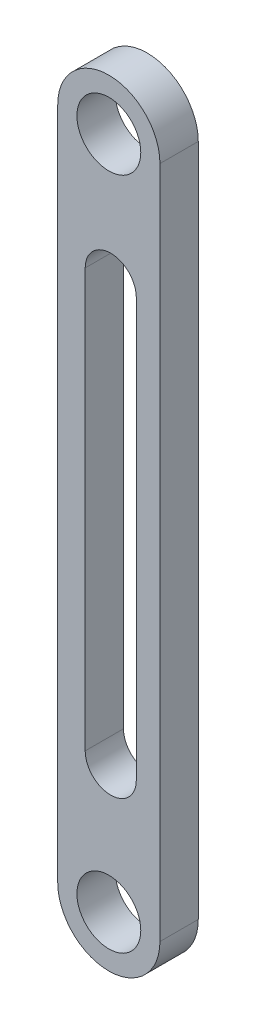
ISO-10303-21;
HEADER;
FILE_DESCRIPTION(('STEP AP214'),'2;1');
FILE_NAME('part.step','',(''),(''),'','','');
FILE_SCHEMA(('AUTOMOTIVE_DESIGN { 1 0 10303 214 1 1 1 1 }'));
ENDSEC;
DATA;
#1=APPLICATION_CONTEXT('core data for automotive mechanical design processes');
#2=APPLICATION_PROTOCOL_DEFINITION('international standard','automotive_design',2000,#1);
#3=PRODUCT_CONTEXT('',#1,'mechanical');
#4=PRODUCT('Part','Part','',(#3));
#5=PRODUCT_RELATED_PRODUCT_CATEGORY('part','',(#4));
#6=PRODUCT_DEFINITION_FORMATION('','',#4);
#7=PRODUCT_DEFINITION_CONTEXT('part definition',#1,'design');
#8=PRODUCT_DEFINITION('design','',#6,#7);
#9=PRODUCT_DEFINITION_SHAPE('','',#8);
#10=(LENGTH_UNIT() NAMED_UNIT(*) SI_UNIT(.MILLI.,.METRE.));
#11=(NAMED_UNIT(*) PLANE_ANGLE_UNIT() SI_UNIT($,.RADIAN.));
#12=(NAMED_UNIT(*) SI_UNIT($,.STERADIAN.) SOLID_ANGLE_UNIT());
#13=UNCERTAINTY_MEASURE_WITH_UNIT(LENGTH_MEASURE(1.E-05),#10,'distance_accuracy_value','');
#14=(GEOMETRIC_REPRESENTATION_CONTEXT(3) GLOBAL_UNCERTAINTY_ASSIGNED_CONTEXT((#13)) GLOBAL_UNIT_ASSIGNED_CONTEXT((#10,
#11,#12)) REPRESENTATION_CONTEXT('',''));
#15=CARTESIAN_POINT('',(0.,0.,0.));
#16=DIRECTION('',(0.,0.,1.));
#17=DIRECTION('',(1.,0.,0.));
#18=AXIS2_PLACEMENT_3D('',#15,#16,#17);
#19=CARTESIAN_POINT('',(-0.794117647058825,-16.5294117647059,3.));
#20=DIRECTION('',(0.,0.,-1.));
#21=DIRECTION('',(-1.,0.,0.));
#22=AXIS2_PLACEMENT_3D('',#19,#20,#21);
#23=CYLINDRICAL_SURFACE('',#22,4.);
#24=CARTESIAN_POINT('',(-0.794117647058825,-16.5294117647059,0.));
#25=DIRECTION('',(0.,0.,1.));
#26=DIRECTION('',(-1.,0.,0.));
#27=AXIS2_PLACEMENT_3D('',#24,#25,#26);
#28=CIRCLE('',#27,4.);
#29=CARTESIAN_POINT('',(-4.79411764705882,-16.5294117647059,0.));
#30=VERTEX_POINT('',#29);
#31=CARTESIAN_POINT('',(3.20588235294117,-16.5294117647059,0.));
#32=VERTEX_POINT('',#31);
#33=EDGE_CURVE('E159',#30,#32,#28,.T.);
#34=ORIENTED_EDGE('',*,*,#33,.T.);
#35=DIRECTION('',(0.,0.,-1.));
#36=VECTOR('',#35,1.);
#37=CARTESIAN_POINT('',(3.20588235294117,-16.5294117647059,3.));
#38=LINE('',#37,#36);
#39=CARTESIAN_POINT('',(3.20588235294117,-16.5294117647059,3.));
#40=VERTEX_POINT('',#39);
#41=EDGE_CURVE('E11',#40,#32,#38,.T.);
#42=ORIENTED_EDGE('',*,*,#41,.F.);
#43=CARTESIAN_POINT('',(-0.794117647058825,-16.5294117647059,3.));
#44=DIRECTION('',(0.,0.,1.));
#45=DIRECTION('',(-1.,0.,0.));
#46=AXIS2_PLACEMENT_3D('',#43,#44,#45);
#47=CIRCLE('',#46,4.);
#48=CARTESIAN_POINT('',(-4.79411764705882,-16.5294117647059,3.));
#49=VERTEX_POINT('',#48);
#50=EDGE_CURVE('E171',#49,#40,#47,.T.);
#51=ORIENTED_EDGE('',*,*,#50,.F.);
#52=DIRECTION('',(0.,0.,-1.));
#53=VECTOR('',#52,1.);
#54=CARTESIAN_POINT('',(-4.79411764705882,-16.5294117647059,3.));
#55=LINE('',#54,#53);
#56=EDGE_CURVE('E189',#49,#30,#55,.T.);
#57=ORIENTED_EDGE('',*,*,#56,.T.);
#58=EDGE_LOOP('',(#34,#42,#51,#57));
#59=FACE_BOUND('',#58,.T.);
#60=ADVANCED_FACE('F44',(#59),#23,.T.);
#61=CARTESIAN_POINT('',(3.20588235294117,36.2105882352941,3.));
#62=DIRECTION('',(-1.,0.,0.));
#63=DIRECTION('',(0.,-1.,0.));
#64=AXIS2_PLACEMENT_3D('',#61,#62,#63);
#65=PLANE('',#64);
#66=DIRECTION('',(0.,1.,0.));
#67=VECTOR('',#66,1.);
#68=CARTESIAN_POINT('',(3.20588235294117,36.2105882352941,0.));
#69=LINE('',#68,#67);
#70=CARTESIAN_POINT('',(3.20588235294117,36.2105882352941,0.));
#71=VERTEX_POINT('',#70);
#72=EDGE_CURVE('E187',#32,#71,#69,.T.);
#73=ORIENTED_EDGE('',*,*,#72,.T.);
#74=DIRECTION('',(0.,0.,-1.));
#75=VECTOR('',#74,1.);
#76=CARTESIAN_POINT('',(3.20588235294117,36.2105882352941,3.));
#77=LINE('',#76,#75);
#78=CARTESIAN_POINT('',(3.20588235294117,36.2105882352941,3.));
#79=VERTEX_POINT('',#78);
#80=EDGE_CURVE('E52',#79,#71,#77,.T.);
#81=ORIENTED_EDGE('',*,*,#80,.F.);
#82=DIRECTION('',(0.,1.,0.));
#83=VECTOR('',#82,1.);
#84=CARTESIAN_POINT('',(3.20588235294117,36.2105882352941,3.));
#85=LINE('',#84,#83);
#86=EDGE_CURVE('E178',#40,#79,#85,.T.);
#87=ORIENTED_EDGE('',*,*,#86,.F.);
#88=ORIENTED_EDGE('',*,*,#41,.T.);
#89=EDGE_LOOP('',(#73,#81,#87,#88));
#90=FACE_BOUND('',#89,.T.);
#91=ADVANCED_FACE('F223',(#90),#65,.F.);
#92=CARTESIAN_POINT('',(-0.794117647058831,36.2105882352941,3.));
#93=DIRECTION('',(0.,0.,-1.));
#94=DIRECTION('',(-1.,0.,0.));
#95=AXIS2_PLACEMENT_3D('',#92,#93,#94);
#96=CYLINDRICAL_SURFACE('',#95,4.);
#97=CARTESIAN_POINT('',(-0.794117647058831,36.2105882352941,0.));
#98=DIRECTION('',(0.,0.,1.));
#99=DIRECTION('',(-1.,0.,0.));
#100=AXIS2_PLACEMENT_3D('',#97,#98,#99);
#101=CIRCLE('',#100,4.);
#102=CARTESIAN_POINT('',(-4.79411764705883,36.2105882352941,0.));
#103=VERTEX_POINT('',#102);
#104=EDGE_CURVE('E192',#71,#103,#101,.T.);
#105=ORIENTED_EDGE('',*,*,#104,.T.);
#106=DIRECTION('',(0.,0.,-1.));
#107=VECTOR('',#106,1.);
#108=CARTESIAN_POINT('',(-4.79411764705883,36.2105882352941,3.));
#109=LINE('',#108,#107);
#110=CARTESIAN_POINT('',(-4.79411764705883,36.2105882352941,3.));
#111=VERTEX_POINT('',#110);
#112=EDGE_CURVE('E203',#111,#103,#109,.T.);
#113=ORIENTED_EDGE('',*,*,#112,.F.);
#114=CARTESIAN_POINT('',(-0.794117647058831,36.2105882352941,3.));
#115=DIRECTION('',(0.,0.,1.));
#116=DIRECTION('',(-1.,0.,0.));
#117=AXIS2_PLACEMENT_3D('',#114,#115,#116);
#118=CIRCLE('',#117,4.);
#119=EDGE_CURVE('E176',#79,#111,#118,.T.);
#120=ORIENTED_EDGE('',*,*,#119,.F.);
#121=ORIENTED_EDGE('',*,*,#80,.T.);
#122=EDGE_LOOP('',(#105,#113,#120,#121));
#123=FACE_BOUND('',#122,.T.);
#124=ADVANCED_FACE('F209',(#123),#96,.T.);
#125=CARTESIAN_POINT('',(-4.79411764705882,-16.5294117647059,3.));
#126=DIRECTION('',(1.,0.,0.));
#127=DIRECTION('',(0.,1.,0.));
#128=AXIS2_PLACEMENT_3D('',#125,#126,#127);
#129=PLANE('',#128);
#130=DIRECTION('',(0.,-1.,0.));
#131=VECTOR('',#130,1.);
#132=CARTESIAN_POINT('',(-4.79411764705882,-16.5294117647059,0.));
#133=LINE('',#132,#131);
#134=EDGE_CURVE('E179',#103,#30,#133,.T.);
#135=ORIENTED_EDGE('',*,*,#134,.T.);
#136=ORIENTED_EDGE('',*,*,#56,.F.);
#137=DIRECTION('',(0.,-1.,0.));
#138=VECTOR('',#137,1.);
#139=CARTESIAN_POINT('',(-4.79411764705882,-16.5294117647059,3.));
#140=LINE('',#139,#138);
#141=EDGE_CURVE('E181',#111,#49,#140,.T.);
#142=ORIENTED_EDGE('',*,*,#141,.F.);
#143=ORIENTED_EDGE('',*,*,#112,.T.);
#144=EDGE_LOOP('',(#135,#136,#142,#143));
#145=FACE_BOUND('',#144,.T.);
#146=ADVANCED_FACE('F217',(#145),#129,.F.);
#147=CARTESIAN_POINT('',(-0.794117647058825,-16.5294117647059,3.));
#148=DIRECTION('',(0.,0.,-1.));
#149=DIRECTION('',(-1.,0.,0.));
#150=AXIS2_PLACEMENT_3D('',#147,#148,#149);
#151=PLANE('',#150);
#152=DIRECTION('',(0.,1.,0.));
#153=VECTOR('',#152,1.);
#154=CARTESIAN_POINT('',(1.35452555751843,26.2105882352941,3.));
#155=LINE('',#154,#153);
#156=CARTESIAN_POINT('',(1.35452555751844,-6.52941176470588,3.));
#157=VERTEX_POINT('',#156);
#158=CARTESIAN_POINT('',(1.35452555751843,26.2105882352941,3.));
#159=VERTEX_POINT('',#158);
#160=EDGE_CURVE('E133',#157,#159,#155,.T.);
#161=ORIENTED_EDGE('',*,*,#160,.F.);
#162=CARTESIAN_POINT('',(-0.645474442481563,-6.52941176470588,3.));
#163=DIRECTION('',(0.,0.,1.));
#164=DIRECTION('',(-1.,0.,0.));
#165=AXIS2_PLACEMENT_3D('',#162,#163,#164);
#166=CIRCLE('',#165,2.);
#167=CARTESIAN_POINT('',(-2.64547444248157,-6.52941176470588,3.));
#168=VERTEX_POINT('',#167);
#169=EDGE_CURVE('E58',#168,#157,#166,.T.);
#170=ORIENTED_EDGE('',*,*,#169,.F.);
#171=DIRECTION('',(0.,-1.,0.));
#172=VECTOR('',#171,1.);
#173=CARTESIAN_POINT('',(-2.64547444248157,-6.52941176470588,3.));
#174=LINE('',#173,#172);
#175=CARTESIAN_POINT('',(-2.64547444248157,26.2105882352941,3.));
#176=VERTEX_POINT('',#175);
#177=EDGE_CURVE('E125',#176,#168,#174,.T.);
#178=ORIENTED_EDGE('',*,*,#177,.F.);
#179=CARTESIAN_POINT('',(-0.645474442481565,26.2105882352941,3.));
#180=DIRECTION('',(0.,0.,1.));
#181=DIRECTION('',(-1.,0.,0.));
#182=AXIS2_PLACEMENT_3D('',#179,#180,#181);
#183=CIRCLE('',#182,2.);
#184=EDGE_CURVE('E142',#159,#176,#183,.T.);
#185=ORIENTED_EDGE('',*,*,#184,.F.);
#186=EDGE_LOOP('',(#161,#170,#178,#185));
#187=FACE_BOUND('',#186,.T.);
#188=CARTESIAN_POINT('',(-0.794117647058825,-16.5294117647059,3.));
#189=DIRECTION('',(0.,0.,1.));
#190=DIRECTION('',(1.,0.,0.));
#191=AXIS2_PLACEMENT_3D('',#188,#189,#190);
#192=CIRCLE('',#191,2.5);
#193=CARTESIAN_POINT('',(1.70588235294118,-16.5294117647059,3.));
#194=VERTEX_POINT('',#193);
#195=EDGE_CURVE('E156',#194,#194,#192,.T.);
#196=ORIENTED_EDGE('',*,*,#195,.F.);
#197=EDGE_LOOP('',(#196));
#198=FACE_BOUND('',#197,.T.);
#199=CARTESIAN_POINT('',(-0.794117647058825,36.2105882352941,3.));
#200=DIRECTION('',(0.,0.,1.));
#201=DIRECTION('',(-1.,0.,0.));
#202=AXIS2_PLACEMENT_3D('',#199,#200,#201);
#203=CIRCLE('',#202,2.5);
#204=CARTESIAN_POINT('',(1.70588235294118,36.2105882352941,3.));
#205=VERTEX_POINT('',#204);
#206=EDGE_CURVE('E116',#205,#205,#203,.T.);
#207=ORIENTED_EDGE('',*,*,#206,.F.);
#208=EDGE_LOOP('',(#207));
#209=FACE_BOUND('',#208,.T.);
#210=ORIENTED_EDGE('',*,*,#50,.T.);
#211=ORIENTED_EDGE('',*,*,#86,.T.);
#212=ORIENTED_EDGE('',*,*,#119,.T.);
#213=ORIENTED_EDGE('',*,*,#141,.T.);
#214=EDGE_LOOP('',(#210,#211,#212,#213));
#215=FACE_BOUND('',#214,.T.);
#216=ADVANCED_FACE('F221',(#187,#198,#209,#215),#151,.F.);
#217=CARTESIAN_POINT('',(-0.794117647058825,-16.5294117647059,0.));
#218=DIRECTION('',(0.,0.,-1.));
#219=DIRECTION('',(-1.,0.,0.));
#220=AXIS2_PLACEMENT_3D('',#217,#218,#219);
#221=PLANE('',#220);
#222=CARTESIAN_POINT('',(-0.645474442481563,-6.52941176470588,0.));
#223=DIRECTION('',(0.,0.,-1.));
#224=DIRECTION('',(-1.,0.,0.));
#225=AXIS2_PLACEMENT_3D('',#222,#223,#224);
#226=CIRCLE('',#225,2.);
#227=CARTESIAN_POINT('',(-2.64547444248157,-6.52941176470588,0.));
#228=VERTEX_POINT('',#227);
#229=CARTESIAN_POINT('',(1.35452555751844,-6.52941176470588,0.));
#230=VERTEX_POINT('',#229);
#231=EDGE_CURVE('E123',#228,#230,#226,.F.);
#232=ORIENTED_EDGE('',*,*,#231,.T.);
#233=DIRECTION('',(0.,1.,0.));
#234=VECTOR('',#233,1.);
#235=CARTESIAN_POINT('',(1.35452555751843,26.2105882352941,0.));
#236=LINE('',#235,#234);
#237=CARTESIAN_POINT('',(1.35452555751843,26.2105882352941,0.));
#238=VERTEX_POINT('',#237);
#239=EDGE_CURVE('E108',#230,#238,#236,.T.);
#240=ORIENTED_EDGE('',*,*,#239,.T.);
#241=CARTESIAN_POINT('',(-0.645474442481565,26.2105882352941,0.));
#242=DIRECTION('',(0.,0.,-1.));
#243=DIRECTION('',(-1.,0.,0.));
#244=AXIS2_PLACEMENT_3D('',#241,#242,#243);
#245=CIRCLE('',#244,2.);
#246=CARTESIAN_POINT('',(-2.64547444248157,26.2105882352941,0.));
#247=VERTEX_POINT('',#246);
#248=EDGE_CURVE('E138',#238,#247,#245,.F.);
#249=ORIENTED_EDGE('',*,*,#248,.T.);
#250=DIRECTION('',(0.,-1.,0.));
#251=VECTOR('',#250,1.);
#252=CARTESIAN_POINT('',(-2.64547444248157,-6.52941176470588,0.));
#253=LINE('',#252,#251);
#254=EDGE_CURVE('E129',#247,#228,#253,.T.);
#255=ORIENTED_EDGE('',*,*,#254,.T.);
#256=EDGE_LOOP('',(#232,#240,#249,#255));
#257=FACE_BOUND('',#256,.T.);
#258=CARTESIAN_POINT('',(-0.794117647058825,-16.5294117647059,0.));
#259=DIRECTION('',(0.,0.,-1.));
#260=DIRECTION('',(-1.,0.,0.));
#261=AXIS2_PLACEMENT_3D('',#258,#259,#260);
#262=CIRCLE('',#261,2.5);
#263=CARTESIAN_POINT('',(1.70588235294118,-16.5294117647059,0.));
#264=VERTEX_POINT('',#263);
#265=EDGE_CURVE('E161',#264,#264,#262,.F.);
#266=ORIENTED_EDGE('',*,*,#265,.T.);
#267=EDGE_LOOP('',(#266));
#268=FACE_BOUND('',#267,.T.);
#269=CARTESIAN_POINT('',(-0.794117647058825,36.2105882352941,0.));
#270=DIRECTION('',(0.,0.,-1.));
#271=DIRECTION('',(-1.,0.,0.));
#272=AXIS2_PLACEMENT_3D('',#269,#270,#271);
#273=CIRCLE('',#272,2.5);
#274=CARTESIAN_POINT('',(1.70588235294118,36.2105882352941,0.));
#275=VERTEX_POINT('',#274);
#276=EDGE_CURVE('E164',#275,#275,#273,.F.);
#277=ORIENTED_EDGE('',*,*,#276,.T.);
#278=EDGE_LOOP('',(#277));
#279=FACE_BOUND('',#278,.T.);
#280=ORIENTED_EDGE('',*,*,#33,.F.);
#281=ORIENTED_EDGE('',*,*,#134,.F.);
#282=ORIENTED_EDGE('',*,*,#104,.F.);
#283=ORIENTED_EDGE('',*,*,#72,.F.);
#284=EDGE_LOOP('',(#280,#281,#282,#283));
#285=FACE_BOUND('',#284,.T.);
#286=ADVANCED_FACE('F130',(#257,#268,#279,#285),#221,.T.);
#287=CARTESIAN_POINT('',(-0.794117647058825,36.2105882352941,-0.00100000000000013));
#288=DIRECTION('',(0.,0.,1.));
#289=DIRECTION('',(1.,0.,0.));
#290=AXIS2_PLACEMENT_3D('',#287,#288,#289);
#291=CYLINDRICAL_SURFACE('',#290,2.5);
#292=CARTESIAN_POINT('',(1.70588235294118,36.2105882352941,0.));
#293=CARTESIAN_POINT('',(1.70588235294118,36.2105882352941,0.03125));
#294=CARTESIAN_POINT('',(1.70588235294118,36.2105882352941,0.0625));
#295=CARTESIAN_POINT('',(1.70588235294118,36.2105882352941,0.125));
#296=CARTESIAN_POINT('',(1.70588235294118,36.2105882352941,0.15625));
#297=CARTESIAN_POINT('',(1.70588235294118,36.2105882352941,0.21875));
#298=CARTESIAN_POINT('',(1.70588235294118,36.2105882352941,0.25));
#299=CARTESIAN_POINT('',(1.70588235294118,36.2105882352941,0.3125));
#300=CARTESIAN_POINT('',(1.70588235294118,36.2105882352941,0.34375));
#301=CARTESIAN_POINT('',(1.70588235294118,36.2105882352941,0.40625));
#302=CARTESIAN_POINT('',(1.70588235294118,36.2105882352941,0.4375));
#303=CARTESIAN_POINT('',(1.70588235294118,36.2105882352941,0.5));
#304=CARTESIAN_POINT('',(1.70588235294118,36.2105882352941,0.53125));
#305=CARTESIAN_POINT('',(1.70588235294118,36.2105882352941,0.59375));
#306=CARTESIAN_POINT('',(1.70588235294118,36.2105882352941,0.625));
#307=CARTESIAN_POINT('',(1.70588235294118,36.2105882352941,0.6875));
#308=CARTESIAN_POINT('',(1.70588235294118,36.2105882352941,0.71875));
#309=CARTESIAN_POINT('',(1.70588235294118,36.2105882352941,0.78125));
#310=CARTESIAN_POINT('',(1.70588235294118,36.2105882352941,0.8125));
#311=CARTESIAN_POINT('',(1.70588235294118,36.2105882352941,0.875));
#312=CARTESIAN_POINT('',(1.70588235294118,36.2105882352941,0.90625));
#313=CARTESIAN_POINT('',(1.70588235294118,36.2105882352941,0.96875));
#314=CARTESIAN_POINT('',(1.70588235294118,36.2105882352941,1.));
#315=CARTESIAN_POINT('',(1.70588235294118,36.2105882352941,1.0625));
#316=CARTESIAN_POINT('',(1.70588235294118,36.2105882352941,1.09375));
#317=CARTESIAN_POINT('',(1.70588235294118,36.2105882352941,1.15625));
#318=CARTESIAN_POINT('',(1.70588235294118,36.2105882352941,1.1875));
#319=CARTESIAN_POINT('',(1.70588235294118,36.2105882352941,1.25));
#320=CARTESIAN_POINT('',(1.70588235294118,36.2105882352941,1.28125));
#321=CARTESIAN_POINT('',(1.70588235294118,36.2105882352941,1.34375));
#322=CARTESIAN_POINT('',(1.70588235294118,36.2105882352941,1.375));
#323=CARTESIAN_POINT('',(1.70588235294118,36.2105882352941,1.4375));
#324=CARTESIAN_POINT('',(1.70588235294118,36.2105882352941,1.46875));
#325=CARTESIAN_POINT('',(1.70588235294118,36.2105882352941,1.53125));
#326=CARTESIAN_POINT('',(1.70588235294118,36.2105882352941,1.5625));
#327=CARTESIAN_POINT('',(1.70588235294118,36.2105882352941,1.625));
#328=CARTESIAN_POINT('',(1.70588235294118,36.2105882352941,1.65625));
#329=CARTESIAN_POINT('',(1.70588235294118,36.2105882352941,1.71875));
#330=CARTESIAN_POINT('',(1.70588235294118,36.2105882352941,1.75));
#331=CARTESIAN_POINT('',(1.70588235294118,36.2105882352941,1.8125));
#332=CARTESIAN_POINT('',(1.70588235294118,36.2105882352941,1.84375));
#333=CARTESIAN_POINT('',(1.70588235294118,36.2105882352941,1.90625));
#334=CARTESIAN_POINT('',(1.70588235294118,36.2105882352941,1.9375));
#335=CARTESIAN_POINT('',(1.70588235294118,36.2105882352941,2.));
#336=CARTESIAN_POINT('',(1.70588235294118,36.2105882352941,2.03125));
#337=CARTESIAN_POINT('',(1.70588235294118,36.2105882352941,2.09375));
#338=CARTESIAN_POINT('',(1.70588235294118,36.2105882352941,2.125));
#339=CARTESIAN_POINT('',(1.70588235294118,36.2105882352941,2.1875));
#340=CARTESIAN_POINT('',(1.70588235294118,36.2105882352941,2.21875));
#341=CARTESIAN_POINT('',(1.70588235294118,36.2105882352941,2.28125));
#342=CARTESIAN_POINT('',(1.70588235294118,36.2105882352941,2.3125));
#343=CARTESIAN_POINT('',(1.70588235294118,36.2105882352941,2.375));
#344=CARTESIAN_POINT('',(1.70588235294118,36.2105882352941,2.40625));
#345=CARTESIAN_POINT('',(1.70588235294118,36.2105882352941,2.46875));
#346=CARTESIAN_POINT('',(1.70588235294118,36.2105882352941,2.5));
#347=CARTESIAN_POINT('',(1.70588235294118,36.2105882352941,2.5625));
#348=CARTESIAN_POINT('',(1.70588235294118,36.2105882352941,2.59375));
#349=CARTESIAN_POINT('',(1.70588235294118,36.2105882352941,2.65625));
#350=CARTESIAN_POINT('',(1.70588235294118,36.2105882352941,2.6875));
#351=CARTESIAN_POINT('',(1.70588235294118,36.2105882352941,2.75));
#352=CARTESIAN_POINT('',(1.70588235294118,36.2105882352941,2.78125));
#353=CARTESIAN_POINT('',(1.70588235294118,36.2105882352941,2.84375));
#354=CARTESIAN_POINT('',(1.70588235294118,36.2105882352941,2.875));
#355=CARTESIAN_POINT('',(1.70588235294118,36.2105882352941,2.9375));
#356=CARTESIAN_POINT('',(1.70588235294118,36.2105882352941,2.96875));
#357=CARTESIAN_POINT('',(1.70588235294118,36.2105882352941,3.));
#358=B_SPLINE_CURVE_WITH_KNOTS('',3,(#292,#293,#294,#295,#296,#297,#298,#299,#300,#301,#302,
#303,#304,#305,#306,#307,#308,#309,#310,#311,#312,#313,#314,#315,#316,#317,#318,#319,#320,#321,
#322,#323,#324,#325,#326,#327,#328,#329,#330,#331,#332,#333,#334,#335,#336,#337,#338,#339,#340,
#341,#342,#343,#344,#345,#346,#347,#348,#349,#350,#351,#352,#353,#354,#355,#356,#357),
.UNSPECIFIED.,.F.,.F.,(4,2,2,2,2,2,2,2,2,2,2,2,2,2,2,2,2,2,2,2,2,2,2,2,2,2,2,2,2,2,2,2,4),(0.,
0.09375,0.1875,0.28125,0.375,0.46875,0.5625,0.65625,0.75,0.84375,0.9375,1.03125,1.125,1.21875,
1.3125,1.40625,1.5,1.59375,1.6875,1.78125,1.875,1.96875,2.0625,2.15625,2.25,2.34375,2.4375,
2.53125,2.625,2.71875,2.8125,2.90625,3.),.UNSPECIFIED.);
#359=EDGE_CURVE('BSEAM240',#275,#205,#358,.T.);
#360=ORIENTED_EDGE('',*,*,#276,.F.);
#361=ORIENTED_EDGE('',*,*,#206,.T.);
#362=ORIENTED_EDGE('',*,*,#359,.T.);
#363=ORIENTED_EDGE('',*,*,#359,.F.);
#364=EDGE_LOOP('',(#360,#362,#361,#363));
#365=FACE_BOUND('',#364,.T.);
#366=ADVANCED_FACE('F240',(#365),#291,.F.);
#367=CARTESIAN_POINT('',(-0.794117647058825,-16.5294117647059,-0.00100000000000013));
#368=DIRECTION('',(0.,0.,1.));
#369=DIRECTION('',(1.,0.,0.));
#370=AXIS2_PLACEMENT_3D('',#367,#368,#369);
#371=CYLINDRICAL_SURFACE('',#370,2.5);
#372=CARTESIAN_POINT('',(1.70588235294118,-16.5294117647059,0.));
#373=CARTESIAN_POINT('',(1.70588235294118,-16.5294117647059,0.03125));
#374=CARTESIAN_POINT('',(1.70588235294118,-16.5294117647059,0.0625));
#375=CARTESIAN_POINT('',(1.70588235294118,-16.5294117647059,0.125));
#376=CARTESIAN_POINT('',(1.70588235294118,-16.5294117647059,0.15625));
#377=CARTESIAN_POINT('',(1.70588235294118,-16.5294117647059,0.21875));
#378=CARTESIAN_POINT('',(1.70588235294118,-16.5294117647059,0.25));
#379=CARTESIAN_POINT('',(1.70588235294118,-16.5294117647059,0.3125));
#380=CARTESIAN_POINT('',(1.70588235294118,-16.5294117647059,0.34375));
#381=CARTESIAN_POINT('',(1.70588235294118,-16.5294117647059,0.40625));
#382=CARTESIAN_POINT('',(1.70588235294118,-16.5294117647059,0.4375));
#383=CARTESIAN_POINT('',(1.70588235294118,-16.5294117647059,0.5));
#384=CARTESIAN_POINT('',(1.70588235294118,-16.5294117647059,0.53125));
#385=CARTESIAN_POINT('',(1.70588235294118,-16.5294117647059,0.59375));
#386=CARTESIAN_POINT('',(1.70588235294118,-16.5294117647059,0.625));
#387=CARTESIAN_POINT('',(1.70588235294118,-16.5294117647059,0.6875));
#388=CARTESIAN_POINT('',(1.70588235294118,-16.5294117647059,0.71875));
#389=CARTESIAN_POINT('',(1.70588235294118,-16.5294117647059,0.78125));
#390=CARTESIAN_POINT('',(1.70588235294118,-16.5294117647059,0.8125));
#391=CARTESIAN_POINT('',(1.70588235294118,-16.5294117647059,0.875));
#392=CARTESIAN_POINT('',(1.70588235294118,-16.5294117647059,0.90625));
#393=CARTESIAN_POINT('',(1.70588235294118,-16.5294117647059,0.96875));
#394=CARTESIAN_POINT('',(1.70588235294118,-16.5294117647059,1.));
#395=CARTESIAN_POINT('',(1.70588235294118,-16.5294117647059,1.0625));
#396=CARTESIAN_POINT('',(1.70588235294118,-16.5294117647059,1.09375));
#397=CARTESIAN_POINT('',(1.70588235294118,-16.5294117647059,1.15625));
#398=CARTESIAN_POINT('',(1.70588235294118,-16.5294117647059,1.1875));
#399=CARTESIAN_POINT('',(1.70588235294118,-16.5294117647059,1.25));
#400=CARTESIAN_POINT('',(1.70588235294118,-16.5294117647059,1.28125));
#401=CARTESIAN_POINT('',(1.70588235294118,-16.5294117647059,1.34375));
#402=CARTESIAN_POINT('',(1.70588235294118,-16.5294117647059,1.375));
#403=CARTESIAN_POINT('',(1.70588235294118,-16.5294117647059,1.4375));
#404=CARTESIAN_POINT('',(1.70588235294118,-16.5294117647059,1.46875));
#405=CARTESIAN_POINT('',(1.70588235294118,-16.5294117647059,1.53125));
#406=CARTESIAN_POINT('',(1.70588235294118,-16.5294117647059,1.5625));
#407=CARTESIAN_POINT('',(1.70588235294118,-16.5294117647059,1.625));
#408=CARTESIAN_POINT('',(1.70588235294118,-16.5294117647059,1.65625));
#409=CARTESIAN_POINT('',(1.70588235294118,-16.5294117647059,1.71875));
#410=CARTESIAN_POINT('',(1.70588235294118,-16.5294117647059,1.75));
#411=CARTESIAN_POINT('',(1.70588235294118,-16.5294117647059,1.8125));
#412=CARTESIAN_POINT('',(1.70588235294118,-16.5294117647059,1.84375));
#413=CARTESIAN_POINT('',(1.70588235294118,-16.5294117647059,1.90625));
#414=CARTESIAN_POINT('',(1.70588235294118,-16.5294117647059,1.9375));
#415=CARTESIAN_POINT('',(1.70588235294118,-16.5294117647059,2.));
#416=CARTESIAN_POINT('',(1.70588235294118,-16.5294117647059,2.03125));
#417=CARTESIAN_POINT('',(1.70588235294118,-16.5294117647059,2.09375));
#418=CARTESIAN_POINT('',(1.70588235294118,-16.5294117647059,2.125));
#419=CARTESIAN_POINT('',(1.70588235294118,-16.5294117647059,2.1875));
#420=CARTESIAN_POINT('',(1.70588235294118,-16.5294117647059,2.21875));
#421=CARTESIAN_POINT('',(1.70588235294118,-16.5294117647059,2.28125));
#422=CARTESIAN_POINT('',(1.70588235294118,-16.5294117647059,2.3125));
#423=CARTESIAN_POINT('',(1.70588235294118,-16.5294117647059,2.375));
#424=CARTESIAN_POINT('',(1.70588235294118,-16.5294117647059,2.40625));
#425=CARTESIAN_POINT('',(1.70588235294118,-16.5294117647059,2.46875));
#426=CARTESIAN_POINT('',(1.70588235294118,-16.5294117647059,2.5));
#427=CARTESIAN_POINT('',(1.70588235294118,-16.5294117647059,2.5625));
#428=CARTESIAN_POINT('',(1.70588235294118,-16.5294117647059,2.59375));
#429=CARTESIAN_POINT('',(1.70588235294118,-16.5294117647059,2.65625));
#430=CARTESIAN_POINT('',(1.70588235294118,-16.5294117647059,2.6875));
#431=CARTESIAN_POINT('',(1.70588235294118,-16.5294117647059,2.75));
#432=CARTESIAN_POINT('',(1.70588235294118,-16.5294117647059,2.78125));
#433=CARTESIAN_POINT('',(1.70588235294118,-16.5294117647059,2.84375));
#434=CARTESIAN_POINT('',(1.70588235294118,-16.5294117647059,2.875));
#435=CARTESIAN_POINT('',(1.70588235294118,-16.5294117647059,2.9375));
#436=CARTESIAN_POINT('',(1.70588235294118,-16.5294117647059,2.96875));
#437=CARTESIAN_POINT('',(1.70588235294118,-16.5294117647059,3.));
#438=B_SPLINE_CURVE_WITH_KNOTS('',3,(#372,#373,#374,#375,#376,#377,#378,#379,#380,#381,#382,
#383,#384,#385,#386,#387,#388,#389,#390,#391,#392,#393,#394,#395,#396,#397,#398,#399,#400,#401,
#402,#403,#404,#405,#406,#407,#408,#409,#410,#411,#412,#413,#414,#415,#416,#417,#418,#419,#420,
#421,#422,#423,#424,#425,#426,#427,#428,#429,#430,#431,#432,#433,#434,#435,#436,#437),
.UNSPECIFIED.,.F.,.F.,(4,2,2,2,2,2,2,2,2,2,2,2,2,2,2,2,2,2,2,2,2,2,2,2,2,2,2,2,2,2,2,2,4),(0.,
0.09375,0.1875,0.28125,0.375,0.46875,0.5625,0.65625,0.75,0.84375,0.9375,1.03125,1.125,1.21875,
1.3125,1.40625,1.5,1.59375,1.6875,1.78125,1.875,1.96875,2.0625,2.15625,2.25,2.34375,2.4375,
2.53125,2.625,2.71875,2.8125,2.90625,3.),.UNSPECIFIED.);
#439=EDGE_CURVE('BSEAM245',#264,#194,#438,.T.);
#440=ORIENTED_EDGE('',*,*,#265,.F.);
#441=ORIENTED_EDGE('',*,*,#195,.T.);
#442=ORIENTED_EDGE('',*,*,#439,.T.);
#443=ORIENTED_EDGE('',*,*,#439,.F.);
#444=EDGE_LOOP('',(#440,#442,#441,#443));
#445=FACE_BOUND('',#444,.T.);
#446=ADVANCED_FACE('F245',(#445),#371,.F.);
#447=CARTESIAN_POINT('',(-0.645474442481563,-6.52941176470588,-0.00100000000000013));
#448=DIRECTION('',(0.,0.,1.));
#449=DIRECTION('',(1.,0.,0.));
#450=AXIS2_PLACEMENT_3D('',#447,#448,#449);
#451=CYLINDRICAL_SURFACE('',#450,2.);
#452=DIRECTION('',(0.,0.,1.));
#453=VECTOR('',#452,1.);
#454=CARTESIAN_POINT('',(-2.64547444248157,-6.52941176470588,-0.00100000000000013));
#455=LINE('',#454,#453);
#456=EDGE_CURVE('E120',#228,#168,#455,.T.);
#457=ORIENTED_EDGE('',*,*,#456,.T.);
#458=ORIENTED_EDGE('',*,*,#169,.T.);
#459=DIRECTION('',(0.,0.,1.));
#460=VECTOR('',#459,1.);
#461=CARTESIAN_POINT('',(1.35452555751844,-6.52941176470588,-0.00100000000000013));
#462=LINE('',#461,#460);
#463=EDGE_CURVE('E112',#230,#157,#462,.T.);
#464=ORIENTED_EDGE('',*,*,#463,.F.);
#465=ORIENTED_EDGE('',*,*,#231,.F.);
#466=EDGE_LOOP('',(#457,#458,#464,#465));
#467=FACE_BOUND('',#466,.T.);
#468=ADVANCED_FACE('F117',(#467),#451,.F.);
#469=CARTESIAN_POINT('',(-2.64547444248157,-6.52941176470588,-0.00100000000000013));
#470=DIRECTION('',(-1.,0.,0.));
#471=DIRECTION('',(0.,0.,1.));
#472=AXIS2_PLACEMENT_3D('',#469,#470,#471);
#473=PLANE('',#472);
#474=DIRECTION('',(0.,0.,1.));
#475=VECTOR('',#474,1.);
#476=CARTESIAN_POINT('',(-2.64547444248157,26.2105882352941,-0.00100000000000013));
#477=LINE('',#476,#475);
#478=EDGE_CURVE('E151',#247,#176,#477,.T.);
#479=ORIENTED_EDGE('',*,*,#478,.T.);
#480=ORIENTED_EDGE('',*,*,#177,.T.);
#481=ORIENTED_EDGE('',*,*,#456,.F.);
#482=ORIENTED_EDGE('',*,*,#254,.F.);
#483=EDGE_LOOP('',(#479,#480,#481,#482));
#484=FACE_BOUND('',#483,.T.);
#485=ADVANCED_FACE('F246',(#484),#473,.F.);
#486=CARTESIAN_POINT('',(-0.645474442481565,26.2105882352941,-0.00100000000000013));
#487=DIRECTION('',(0.,0.,1.));
#488=DIRECTION('',(1.,0.,0.));
#489=AXIS2_PLACEMENT_3D('',#486,#487,#488);
#490=CYLINDRICAL_SURFACE('',#489,2.);
#491=DIRECTION('',(0.,0.,1.));
#492=VECTOR('',#491,1.);
#493=CARTESIAN_POINT('',(1.35452555751843,26.2105882352941,-0.00100000000000013));
#494=LINE('',#493,#492);
#495=EDGE_CURVE('E67',#238,#159,#494,.T.);
#496=ORIENTED_EDGE('',*,*,#495,.T.);
#497=ORIENTED_EDGE('',*,*,#184,.T.);
#498=ORIENTED_EDGE('',*,*,#478,.F.);
#499=ORIENTED_EDGE('',*,*,#248,.F.);
#500=EDGE_LOOP('',(#496,#497,#498,#499));
#501=FACE_BOUND('',#500,.T.);
#502=ADVANCED_FACE('F251',(#501),#490,.F.);
#503=CARTESIAN_POINT('',(1.35452555751843,26.2105882352941,-0.00100000000000013));
#504=DIRECTION('',(1.,0.,0.));
#505=DIRECTION('',(0.,1.,0.));
#506=AXIS2_PLACEMENT_3D('',#503,#504,#505);
#507=PLANE('',#506);
#508=ORIENTED_EDGE('',*,*,#463,.T.);
#509=ORIENTED_EDGE('',*,*,#160,.T.);
#510=ORIENTED_EDGE('',*,*,#495,.F.);
#511=ORIENTED_EDGE('',*,*,#239,.F.);
#512=EDGE_LOOP('',(#508,#509,#510,#511));
#513=FACE_BOUND('',#512,.T.);
#514=ADVANCED_FACE('F109',(#513),#507,.F.);
#515=CLOSED_SHELL('',(#60,#91,#124,#146,#216,#286,#366,#446,#468,#485,#502,#514));
#516=MANIFOLD_SOLID_BREP('B2',#515);
#517=ADVANCED_BREP_SHAPE_REPRESENTATION('',(#18,#516),#14);
#518=SHAPE_DEFINITION_REPRESENTATION(#9,#517);
ENDSEC;
END-ISO-10303-21;
